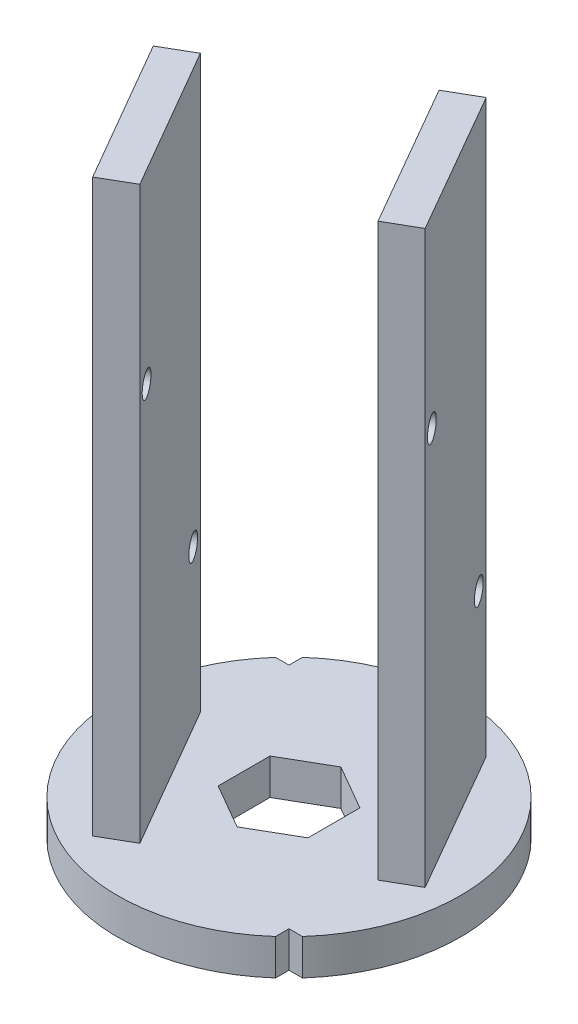
ISO-10303-21;
HEADER;
FILE_DESCRIPTION(('STEP AP214'),'2;1');
FILE_NAME('part.step','',(''),(''),'','','');
FILE_SCHEMA(('AUTOMOTIVE_DESIGN { 1 0 10303 214 1 1 1 1 }'));
ENDSEC;
DATA;
#1=APPLICATION_CONTEXT('core data for automotive mechanical design processes');
#2=APPLICATION_PROTOCOL_DEFINITION('international standard','automotive_design',2000,#1);
#3=PRODUCT_CONTEXT('',#1,'mechanical');
#4=PRODUCT('Part','Part','',(#3));
#5=PRODUCT_RELATED_PRODUCT_CATEGORY('part','',(#4));
#6=PRODUCT_DEFINITION_FORMATION('','',#4);
#7=PRODUCT_DEFINITION_CONTEXT('part definition',#1,'design');
#8=PRODUCT_DEFINITION('design','',#6,#7);
#9=PRODUCT_DEFINITION_SHAPE('','',#8);
#10=(LENGTH_UNIT() NAMED_UNIT(*) SI_UNIT(.MILLI.,.METRE.));
#11=(NAMED_UNIT(*) PLANE_ANGLE_UNIT() SI_UNIT($,.RADIAN.));
#12=(NAMED_UNIT(*) SI_UNIT($,.STERADIAN.) SOLID_ANGLE_UNIT());
#13=UNCERTAINTY_MEASURE_WITH_UNIT(LENGTH_MEASURE(1.E-05),#10,'distance_accuracy_value','');
#14=(GEOMETRIC_REPRESENTATION_CONTEXT(3) GLOBAL_UNCERTAINTY_ASSIGNED_CONTEXT((#13)) GLOBAL_UNIT_ASSIGNED_CONTEXT((#10,
#11,#12)) REPRESENTATION_CONTEXT('',''));
#15=CARTESIAN_POINT('',(0.,0.,0.));
#16=DIRECTION('',(0.,0.,1.));
#17=DIRECTION('',(1.,0.,0.));
#18=AXIS2_PLACEMENT_3D('',#15,#16,#17);
#19=CARTESIAN_POINT('',(5.00000000000001,8.,-8.6602540378444));
#20=DIRECTION('',(-0.5,0.,0.866025403784439));
#21=DIRECTION('',(0.866025403784439,0.,0.5));
#22=AXIS2_PLACEMENT_3D('',#19,#20,#21);
#23=PLANE('',#22);
#24=DIRECTION('',(-0.866025403784439,0.,-0.5));
#25=VECTOR('',#24,1.);
#26=CARTESIAN_POINT('',(5.00000000000001,0.,-8.6602540378444));
#27=LINE('',#26,#25);
#28=CARTESIAN_POINT('',(10.,0.,-5.77350269189628));
#29=VERTEX_POINT('',#28);
#30=CARTESIAN_POINT('',(0.,0.,-11.5470053837925));
#31=VERTEX_POINT('',#30);
#32=EDGE_CURVE('E302',#29,#31,#27,.T.);
#33=ORIENTED_EDGE('',*,*,#32,.F.);
#34=DIRECTION('',(0.,-1.,0.));
#35=VECTOR('',#34,1.);
#36=CARTESIAN_POINT('',(10.,8.,-5.77350269189628));
#37=LINE('',#36,#35);
#38=CARTESIAN_POINT('',(10.,8.,-5.77350269189628));
#39=VERTEX_POINT('',#38);
#40=EDGE_CURVE('E11',#39,#29,#37,.T.);
#41=ORIENTED_EDGE('',*,*,#40,.F.);
#42=DIRECTION('',(-0.866025403784439,0.,-0.5));
#43=VECTOR('',#42,1.);
#44=CARTESIAN_POINT('',(5.00000000000001,8.,-8.6602540378444));
#45=LINE('',#44,#43);
#46=CARTESIAN_POINT('',(0.,8.,-11.5470053837925));
#47=VERTEX_POINT('',#46);
#48=EDGE_CURVE('E267',#39,#47,#45,.T.);
#49=ORIENTED_EDGE('',*,*,#48,.T.);
#50=DIRECTION('',(0.,-1.,0.));
#51=VECTOR('',#50,1.);
#52=CARTESIAN_POINT('',(0.,8.,-11.5470053837925));
#53=LINE('',#52,#51);
#54=EDGE_CURVE('E319',#47,#31,#53,.T.);
#55=ORIENTED_EDGE('',*,*,#54,.T.);
#56=EDGE_LOOP('',(#33,#41,#49,#55));
#57=FACE_BOUND('',#56,.T.);
#58=ADVANCED_FACE('F41',(#57),#23,.T.);
#59=CARTESIAN_POINT('',(10.,8.,0.));
#60=DIRECTION('',(-1.,0.,0.));
#61=DIRECTION('',(0.,0.,1.));
#62=AXIS2_PLACEMENT_3D('',#59,#60,#61);
#63=PLANE('',#62);
#64=DIRECTION('',(0.,0.,-1.));
#65=VECTOR('',#64,1.);
#66=CARTESIAN_POINT('',(10.,0.,0.));
#67=LINE('',#66,#65);
#68=CARTESIAN_POINT('',(9.99999999999999,0.,5.77350269189625));
#69=VERTEX_POINT('',#68);
#70=EDGE_CURVE('E305',#69,#29,#67,.T.);
#71=ORIENTED_EDGE('',*,*,#70,.F.);
#72=DIRECTION('',(0.,-1.,0.));
#73=VECTOR('',#72,1.);
#74=CARTESIAN_POINT('',(9.99999999999999,8.,5.77350269189625));
#75=LINE('',#74,#73);
#76=CARTESIAN_POINT('',(9.99999999999999,8.,5.77350269189625));
#77=VERTEX_POINT('',#76);
#78=EDGE_CURVE('E50',#77,#69,#75,.T.);
#79=ORIENTED_EDGE('',*,*,#78,.F.);
#80=DIRECTION('',(0.,0.,-1.));
#81=VECTOR('',#80,1.);
#82=CARTESIAN_POINT('',(10.,8.,0.));
#83=LINE('',#82,#81);
#84=EDGE_CURVE('E270',#77,#39,#83,.T.);
#85=ORIENTED_EDGE('',*,*,#84,.T.);
#86=ORIENTED_EDGE('',*,*,#40,.T.);
#87=EDGE_LOOP('',(#71,#79,#85,#86));
#88=FACE_BOUND('',#87,.T.);
#89=ADVANCED_FACE('F379',(#88),#63,.T.);
#90=CARTESIAN_POINT('',(4.99999999999999,8.,8.66025403784438));
#91=DIRECTION('',(-0.5,0.,-0.866025403784439));
#92=DIRECTION('',(-0.866025403784439,0.,0.5));
#93=AXIS2_PLACEMENT_3D('',#90,#91,#92);
#94=PLANE('',#93);
#95=DIRECTION('',(0.866025403784439,0.,-0.5));
#96=VECTOR('',#95,1.);
#97=CARTESIAN_POINT('',(4.99999999999999,0.,8.66025403784438));
#98=LINE('',#97,#96);
#99=CARTESIAN_POINT('',(0.,0.,11.5470053837925));
#100=VERTEX_POINT('',#99);
#101=EDGE_CURVE('E308',#100,#69,#98,.T.);
#102=ORIENTED_EDGE('',*,*,#101,.F.);
#103=DIRECTION('',(0.,-1.,0.));
#104=VECTOR('',#103,1.);
#105=CARTESIAN_POINT('',(0.,8.,11.5470053837925));
#106=LINE('',#105,#104);
#107=CARTESIAN_POINT('',(0.,8.,11.5470053837925));
#108=VERTEX_POINT('',#107);
#109=EDGE_CURVE('E325',#108,#100,#106,.T.);
#110=ORIENTED_EDGE('',*,*,#109,.F.);
#111=DIRECTION('',(0.866025403784439,0.,-0.5));
#112=VECTOR('',#111,1.);
#113=CARTESIAN_POINT('',(4.99999999999999,8.,8.66025403784438));
#114=LINE('',#113,#112);
#115=EDGE_CURVE('E273',#108,#77,#114,.T.);
#116=ORIENTED_EDGE('',*,*,#115,.T.);
#117=ORIENTED_EDGE('',*,*,#78,.T.);
#118=EDGE_LOOP('',(#102,#110,#116,#117));
#119=FACE_BOUND('',#118,.T.);
#120=ADVANCED_FACE('F383',(#119),#94,.T.);
#121=CARTESIAN_POINT('',(-5.,8.,8.66025403784438));
#122=DIRECTION('',(0.5,0.,-0.866025403784439));
#123=DIRECTION('',(-0.866025403784439,0.,-0.5));
#124=AXIS2_PLACEMENT_3D('',#121,#122,#123);
#125=PLANE('',#124);
#126=DIRECTION('',(0.866025403784439,0.,0.5));
#127=VECTOR('',#126,1.);
#128=CARTESIAN_POINT('',(-5.,0.,8.66025403784438));
#129=LINE('',#128,#127);
#130=CARTESIAN_POINT('',(-10.,0.,5.77350269189625));
#131=VERTEX_POINT('',#130);
#132=EDGE_CURVE('E311',#131,#100,#129,.T.);
#133=ORIENTED_EDGE('',*,*,#132,.F.);
#134=DIRECTION('',(0.,-1.,0.));
#135=VECTOR('',#134,1.);
#136=CARTESIAN_POINT('',(-10.,8.,5.77350269189625));
#137=LINE('',#136,#135);
#138=CARTESIAN_POINT('',(-10.,8.,5.77350269189625));
#139=VERTEX_POINT('',#138);
#140=EDGE_CURVE('E323',#139,#131,#137,.T.);
#141=ORIENTED_EDGE('',*,*,#140,.F.);
#142=DIRECTION('',(0.866025403784439,0.,0.5));
#143=VECTOR('',#142,1.);
#144=CARTESIAN_POINT('',(-5.,8.,8.66025403784438));
#145=LINE('',#144,#143);
#146=EDGE_CURVE('E276',#139,#108,#145,.T.);
#147=ORIENTED_EDGE('',*,*,#146,.T.);
#148=ORIENTED_EDGE('',*,*,#109,.T.);
#149=EDGE_LOOP('',(#133,#141,#147,#148));
#150=FACE_BOUND('',#149,.T.);
#151=ADVANCED_FACE('F387',(#150),#125,.T.);
#152=CARTESIAN_POINT('',(-10.,8.,0.));
#153=DIRECTION('',(1.,0.,0.));
#154=DIRECTION('',(0.,0.,-1.));
#155=AXIS2_PLACEMENT_3D('',#152,#153,#154);
#156=PLANE('',#155);
#157=DIRECTION('',(0.,0.,1.));
#158=VECTOR('',#157,1.);
#159=CARTESIAN_POINT('',(-10.,0.,0.));
#160=LINE('',#159,#158);
#161=CARTESIAN_POINT('',(-10.,0.,-5.77350269189628));
#162=VERTEX_POINT('',#161);
#163=EDGE_CURVE('E314',#162,#131,#160,.T.);
#164=ORIENTED_EDGE('',*,*,#163,.F.);
#165=DIRECTION('',(0.,-1.,0.));
#166=VECTOR('',#165,1.);
#167=CARTESIAN_POINT('',(-10.,8.,-5.77350269189628));
#168=LINE('',#167,#166);
#169=CARTESIAN_POINT('',(-10.,8.,-5.77350269189628));
#170=VERTEX_POINT('',#169);
#171=EDGE_CURVE('E321',#170,#162,#168,.T.);
#172=ORIENTED_EDGE('',*,*,#171,.F.);
#173=DIRECTION('',(0.,0.,1.));
#174=VECTOR('',#173,1.);
#175=CARTESIAN_POINT('',(-10.,8.,0.));
#176=LINE('',#175,#174);
#177=EDGE_CURVE('E279',#170,#139,#176,.T.);
#178=ORIENTED_EDGE('',*,*,#177,.T.);
#179=ORIENTED_EDGE('',*,*,#140,.T.);
#180=EDGE_LOOP('',(#164,#172,#178,#179));
#181=FACE_BOUND('',#180,.T.);
#182=ADVANCED_FACE('F390',(#181),#156,.T.);
#183=CARTESIAN_POINT('',(0.,8.,-25.4));
#184=DIRECTION('',(0.,0.,1.));
#185=DIRECTION('',(1.,0.,0.));
#186=AXIS2_PLACEMENT_3D('',#183,#184,#185);
#187=PLANE('',#186);
#188=DIRECTION('',(-1.,0.,0.));
#189=VECTOR('',#188,1.);
#190=CARTESIAN_POINT('',(0.,0.,-25.4));
#191=LINE('',#190,#189);
#192=CARTESIAN_POINT('',(-25.4,0.,-25.4));
#193=VERTEX_POINT('',#192);
#194=CARTESIAN_POINT('',(-28.3980633142473,0.,-25.4));
#195=VERTEX_POINT('',#194);
#196=EDGE_CURVE('E250',#193,#195,#191,.T.);
#197=ORIENTED_EDGE('',*,*,#196,.T.);
#198=DIRECTION('',(0.,-1.,0.));
#199=VECTOR('',#198,1.);
#200=CARTESIAN_POINT('',(-28.3980633142473,8.,-25.4));
#201=LINE('',#200,#199);
#202=CARTESIAN_POINT('',(-28.3980633142473,8.,-25.4));
#203=VERTEX_POINT('',#202);
#204=EDGE_CURVE('E45',#203,#195,#201,.T.);
#205=ORIENTED_EDGE('',*,*,#204,.F.);
#206=DIRECTION('',(-1.,0.,0.));
#207=VECTOR('',#206,1.);
#208=CARTESIAN_POINT('',(0.,8.,-25.4));
#209=LINE('',#208,#207);
#210=CARTESIAN_POINT('',(-25.4,8.,-25.4));
#211=VERTEX_POINT('',#210);
#212=EDGE_CURVE('E251',#211,#203,#209,.T.);
#213=ORIENTED_EDGE('',*,*,#212,.F.);
#214=DIRECTION('',(0.,-1.,0.));
#215=VECTOR('',#214,1.);
#216=CARTESIAN_POINT('',(-25.4,8.,-25.4));
#217=LINE('',#216,#215);
#218=EDGE_CURVE('E285',#211,#193,#217,.T.);
#219=ORIENTED_EDGE('',*,*,#218,.T.);
#220=EDGE_LOOP('',(#197,#205,#213,#219));
#221=FACE_BOUND('',#220,.T.);
#222=ADVANCED_FACE('F43',(#221),#187,.F.);
#223=CARTESIAN_POINT('',(0.,8.,0.));
#224=DIRECTION('',(0.,-1.,0.));
#225=DIRECTION('',(0.,0.,-1.));
#226=AXIS2_PLACEMENT_3D('',#223,#224,#225);
#227=CYLINDRICAL_SURFACE('',#226,38.1);
#228=CARTESIAN_POINT('',(0.,0.,0.));
#229=DIRECTION('',(0.,1.,0.));
#230=DIRECTION('',(0.,0.,1.));
#231=AXIS2_PLACEMENT_3D('',#228,#229,#230);
#232=CIRCLE('',#231,38.1);
#233=CARTESIAN_POINT('',(25.4,0.,28.3980633142473));
#234=VERTEX_POINT('',#233);
#235=EDGE_CURVE('E288',#195,#234,#232,.T.);
#236=ORIENTED_EDGE('',*,*,#235,.T.);
#237=DIRECTION('',(0.,-1.,0.));
#238=VECTOR('',#237,1.);
#239=CARTESIAN_POINT('',(25.4,8.,28.3980633142473));
#240=LINE('',#239,#238);
#241=CARTESIAN_POINT('',(25.4,8.,28.3980633142473));
#242=VERTEX_POINT('',#241);
#243=EDGE_CURVE('E335',#242,#234,#240,.T.);
#244=ORIENTED_EDGE('',*,*,#243,.F.);
#245=CARTESIAN_POINT('',(0.,8.,0.));
#246=DIRECTION('',(0.,1.,0.));
#247=DIRECTION('',(0.,0.,1.));
#248=AXIS2_PLACEMENT_3D('',#245,#246,#247);
#249=CIRCLE('',#248,38.1);
#250=EDGE_CURVE('E254',#203,#242,#249,.T.);
#251=ORIENTED_EDGE('',*,*,#250,.F.);
#252=ORIENTED_EDGE('',*,*,#204,.T.);
#253=EDGE_LOOP('',(#236,#244,#251,#252));
#254=FACE_BOUND('',#253,.T.);
#255=ADVANCED_FACE('F342',(#254),#227,.T.);
#256=CARTESIAN_POINT('',(25.4,8.,0.));
#257=DIRECTION('',(1.,0.,0.));
#258=DIRECTION('',(0.,0.,-1.));
#259=AXIS2_PLACEMENT_3D('',#256,#257,#258);
#260=PLANE('',#259);
#261=DIRECTION('',(0.,0.,1.));
#262=VECTOR('',#261,1.);
#263=CARTESIAN_POINT('',(25.4,0.,0.));
#264=LINE('',#263,#262);
#265=CARTESIAN_POINT('',(25.4,0.,25.4));
#266=VERTEX_POINT('',#265);
#267=EDGE_CURVE('E291',#266,#234,#264,.T.);
#268=ORIENTED_EDGE('',*,*,#267,.F.);
#269=DIRECTION('',(0.,-1.,0.));
#270=VECTOR('',#269,1.);
#271=CARTESIAN_POINT('',(25.4,8.,25.4));
#272=LINE('',#271,#270);
#273=CARTESIAN_POINT('',(25.4,8.,25.4));
#274=VERTEX_POINT('',#273);
#275=EDGE_CURVE('E334',#274,#266,#272,.T.);
#276=ORIENTED_EDGE('',*,*,#275,.F.);
#277=DIRECTION('',(0.,0.,1.));
#278=VECTOR('',#277,1.);
#279=CARTESIAN_POINT('',(25.4,8.,0.));
#280=LINE('',#279,#278);
#281=EDGE_CURVE('E257',#274,#242,#280,.T.);
#282=ORIENTED_EDGE('',*,*,#281,.T.);
#283=ORIENTED_EDGE('',*,*,#243,.T.);
#284=EDGE_LOOP('',(#268,#276,#282,#283));
#285=FACE_BOUND('',#284,.T.);
#286=ADVANCED_FACE('F361',(#285),#260,.T.);
#287=CARTESIAN_POINT('',(0.,8.,25.4));
#288=DIRECTION('',(0.,0.,-1.));
#289=DIRECTION('',(-1.,0.,0.));
#290=AXIS2_PLACEMENT_3D('',#287,#288,#289);
#291=PLANE('',#290);
#292=DIRECTION('',(1.,0.,0.));
#293=VECTOR('',#292,1.);
#294=CARTESIAN_POINT('',(0.,0.,25.4));
#295=LINE('',#294,#293);
#296=CARTESIAN_POINT('',(28.3980633142473,0.,25.4));
#297=VERTEX_POINT('',#296);
#298=EDGE_CURVE('E294',#266,#297,#295,.T.);
#299=ORIENTED_EDGE('',*,*,#298,.T.);
#300=DIRECTION('',(0.,-1.,0.));
#301=VECTOR('',#300,1.);
#302=CARTESIAN_POINT('',(28.3980633142473,8.,25.4));
#303=LINE('',#302,#301);
#304=CARTESIAN_POINT('',(28.3980633142473,8.,25.4));
#305=VERTEX_POINT('',#304);
#306=EDGE_CURVE('E331',#305,#297,#303,.T.);
#307=ORIENTED_EDGE('',*,*,#306,.F.);
#308=DIRECTION('',(1.,0.,0.));
#309=VECTOR('',#308,1.);
#310=CARTESIAN_POINT('',(0.,8.,25.4));
#311=LINE('',#310,#309);
#312=EDGE_CURVE('E260',#274,#305,#311,.T.);
#313=ORIENTED_EDGE('',*,*,#312,.F.);
#314=ORIENTED_EDGE('',*,*,#275,.T.);
#315=EDGE_LOOP('',(#299,#307,#313,#314));
#316=FACE_BOUND('',#315,.T.);
#317=ADVANCED_FACE('F364',(#316),#291,.F.);
#318=CARTESIAN_POINT('',(0.,8.,0.));
#319=DIRECTION('',(0.,-1.,0.));
#320=DIRECTION('',(0.,0.,-1.));
#321=AXIS2_PLACEMENT_3D('',#318,#319,#320);
#322=CYLINDRICAL_SURFACE('',#321,38.1);
#323=CARTESIAN_POINT('',(0.,0.,0.));
#324=DIRECTION('',(0.,1.,0.));
#325=DIRECTION('',(0.,0.,1.));
#326=AXIS2_PLACEMENT_3D('',#323,#324,#325);
#327=CIRCLE('',#326,38.1);
#328=CARTESIAN_POINT('',(-25.4,0.,-28.3980633142473));
#329=VERTEX_POINT('',#328);
#330=EDGE_CURVE('E296',#297,#329,#327,.T.);
#331=ORIENTED_EDGE('',*,*,#330,.T.);
#332=DIRECTION('',(0.,-1.,0.));
#333=VECTOR('',#332,1.);
#334=CARTESIAN_POINT('',(-25.4,8.,-28.3980633142473));
#335=LINE('',#334,#333);
#336=CARTESIAN_POINT('',(-25.4,8.,-28.3980633142473));
#337=VERTEX_POINT('',#336);
#338=EDGE_CURVE('E329',#337,#329,#335,.T.);
#339=ORIENTED_EDGE('',*,*,#338,.F.);
#340=CARTESIAN_POINT('',(0.,8.,0.));
#341=DIRECTION('',(0.,1.,0.));
#342=DIRECTION('',(0.,0.,1.));
#343=AXIS2_PLACEMENT_3D('',#340,#341,#342);
#344=CIRCLE('',#343,38.1);
#345=EDGE_CURVE('E262',#305,#337,#344,.T.);
#346=ORIENTED_EDGE('',*,*,#345,.F.);
#347=ORIENTED_EDGE('',*,*,#306,.T.);
#348=EDGE_LOOP('',(#331,#339,#346,#347));
#349=FACE_BOUND('',#348,.T.);
#350=ADVANCED_FACE('F357',(#349),#322,.T.);
#351=CARTESIAN_POINT('',(-25.4,8.,0.));
#352=DIRECTION('',(-1.,0.,0.));
#353=DIRECTION('',(0.,0.,1.));
#354=AXIS2_PLACEMENT_3D('',#351,#352,#353);
#355=PLANE('',#354);
#356=DIRECTION('',(0.,0.,-1.));
#357=VECTOR('',#356,1.);
#358=CARTESIAN_POINT('',(-25.4,0.,0.));
#359=LINE('',#358,#357);
#360=EDGE_CURVE('E299',#193,#329,#359,.T.);
#361=ORIENTED_EDGE('',*,*,#360,.F.);
#362=ORIENTED_EDGE('',*,*,#218,.F.);
#363=DIRECTION('',(0.,0.,-1.));
#364=VECTOR('',#363,1.);
#365=CARTESIAN_POINT('',(-25.4,8.,0.));
#366=LINE('',#365,#364);
#367=EDGE_CURVE('E264',#211,#337,#366,.T.);
#368=ORIENTED_EDGE('',*,*,#367,.T.);
#369=ORIENTED_EDGE('',*,*,#338,.T.);
#370=EDGE_LOOP('',(#361,#362,#368,#369));
#371=FACE_BOUND('',#370,.T.);
#372=ADVANCED_FACE('F352',(#371),#355,.T.);
#373=CARTESIAN_POINT('',(-5.,8.,-8.66025403784441));
#374=DIRECTION('',(0.499999999999999,0.,0.866025403784439));
#375=DIRECTION('',(0.866025403784439,0.,-0.499999999999999));
#376=AXIS2_PLACEMENT_3D('',#373,#374,#375);
#377=PLANE('',#376);
#378=DIRECTION('',(-0.866025403784439,0.,0.499999999999999));
#379=VECTOR('',#378,1.);
#380=CARTESIAN_POINT('',(-5.,0.,-8.66025403784441));
#381=LINE('',#380,#379);
#382=EDGE_CURVE('E255',#31,#162,#381,.T.);
#383=ORIENTED_EDGE('',*,*,#382,.F.);
#384=ORIENTED_EDGE('',*,*,#54,.F.);
#385=DIRECTION('',(-0.866025403784439,0.,0.499999999999999));
#386=VECTOR('',#385,1.);
#387=CARTESIAN_POINT('',(-5.,8.,-8.66025403784441));
#388=LINE('',#387,#386);
#389=EDGE_CURVE('E282',#47,#170,#388,.T.);
#390=ORIENTED_EDGE('',*,*,#389,.T.);
#391=ORIENTED_EDGE('',*,*,#171,.T.);
#392=EDGE_LOOP('',(#383,#384,#390,#391));
#393=FACE_BOUND('',#392,.T.);
#394=ADVANCED_FACE('F369',(#393),#377,.T.);
#395=CARTESIAN_POINT('',(0.,8.,0.));
#396=DIRECTION('',(0.,1.,0.));
#397=DIRECTION('',(0.,0.,1.));
#398=AXIS2_PLACEMENT_3D('',#395,#396,#397);
#399=PLANE('',#398);
#400=DIRECTION('',(0.866596907699709,0.,-0.499008817121804));
#401=VECTOR('',#400,1.);
#402=CARTESIAN_POINT('',(14.151892841374,7.99999999999999,-29.7321401224026));
#403=LINE('',#402,#401);
#404=CARTESIAN_POINT('',(7.49466333586674,8.,-25.8987359279779));
#405=VERTEX_POINT('',#404);
#406=CARTESIAN_POINT('',(14.151892841374,7.99999999999999,-29.7321401224026));
#407=VERTEX_POINT('',#406);
#408=EDGE_CURVE('E184',#405,#407,#403,.T.);
#409=ORIENTED_EDGE('',*,*,#408,.T.);
#410=DIRECTION('',(0.499008817121804,0.,0.866596907699709));
#411=VECTOR('',#410,1.);
#412=CARTESIAN_POINT('',(14.151892841374,7.99999999999999,-29.7321401224026));
#413=LINE('',#412,#411);
#414=CARTESIAN_POINT('',(32.5956910765059,8.,2.29803242843875));
#415=VERTEX_POINT('',#414);
#416=EDGE_CURVE('E198',#407,#415,#413,.T.);
#417=ORIENTED_EDGE('',*,*,#416,.T.);
#418=DIRECTION('',(-0.866596907699709,0.,0.499008817121804));
#419=VECTOR('',#418,1.);
#420=CARTESIAN_POINT('',(32.5956910765059,7.99999999999999,2.29803242843875));
#421=LINE('',#420,#419);
#422=CARTESIAN_POINT('',(25.9384615709986,8.,6.13143662286348));
#423=VERTEX_POINT('',#422);
#424=EDGE_CURVE('E63',#415,#423,#421,.T.);
#425=ORIENTED_EDGE('',*,*,#424,.T.);
#426=DIRECTION('',(-0.499008817121804,0.,-0.866596907699709));
#427=VECTOR('',#426,1.);
#428=CARTESIAN_POINT('',(7.49466333586675,7.99999999999999,-25.8987359279779));
#429=LINE('',#428,#427);
#430=EDGE_CURVE('E58',#423,#405,#429,.T.);
#431=ORIENTED_EDGE('',*,*,#430,.T.);
#432=EDGE_LOOP('',(#409,#417,#425,#431));
#433=FACE_BOUND('',#432,.T.);
#434=DIRECTION('',(-0.86545276618976,0.,0.500990528348084));
#435=VECTOR('',#434,1.);
#436=CARTESIAN_POINT('',(-32.8247350755662,8.,-2.61017134893628));
#437=LINE('',#436,#435);
#438=CARTESIAN_POINT('',(-26.176294907467,8.,-6.45879912231654));
#439=VERTEX_POINT('',#438);
#440=CARTESIAN_POINT('',(-32.8247350755662,8.,-2.61017134893628));
#441=VERTEX_POINT('',#440);
#442=EDGE_CURVE('E187',#439,#441,#437,.T.);
#443=ORIENTED_EDGE('',*,*,#442,.F.);
#444=DIRECTION('',(-0.500990528348084,0.,-0.86545276618976));
#445=VECTOR('',#444,1.);
#446=CARTESIAN_POINT('',(-26.176294907467,8.,-6.45879912231654));
#447=LINE('',#446,#445);
#448=CARTESIAN_POINT('',(-7.65925090840529,8.,25.5290849670029));
#449=VERTEX_POINT('',#448);
#450=EDGE_CURVE('E222',#449,#439,#447,.T.);
#451=ORIENTED_EDGE('',*,*,#450,.F.);
#452=DIRECTION('',(0.86545276618976,0.,-0.500990528348084));
#453=VECTOR('',#452,1.);
#454=CARTESIAN_POINT('',(-14.3076910765046,8.,29.3777127403832));
#455=LINE('',#454,#453);
#456=CARTESIAN_POINT('',(-14.3076910765046,8.,29.3777127403832));
#457=VERTEX_POINT('',#456);
#458=EDGE_CURVE('E234',#457,#449,#455,.T.);
#459=ORIENTED_EDGE('',*,*,#458,.F.);
#460=DIRECTION('',(0.500990528348084,0.,0.86545276618976));
#461=VECTOR('',#460,1.);
#462=CARTESIAN_POINT('',(-32.8247350755662,8.,-2.61017134893628));
#463=LINE('',#462,#461);
#464=EDGE_CURVE('E231',#441,#457,#463,.T.);
#465=ORIENTED_EDGE('',*,*,#464,.F.);
#466=EDGE_LOOP('',(#443,#451,#459,#465));
#467=FACE_BOUND('',#466,.T.);
#468=ORIENTED_EDGE('',*,*,#212,.T.);
#469=ORIENTED_EDGE('',*,*,#250,.T.);
#470=ORIENTED_EDGE('',*,*,#281,.F.);
#471=ORIENTED_EDGE('',*,*,#312,.T.);
#472=ORIENTED_EDGE('',*,*,#345,.T.);
#473=ORIENTED_EDGE('',*,*,#367,.F.);
#474=EDGE_LOOP('',(#468,#469,#470,#471,#472,#473));
#475=FACE_BOUND('',#474,.T.);
#476=ORIENTED_EDGE('',*,*,#48,.F.);
#477=ORIENTED_EDGE('',*,*,#84,.F.);
#478=ORIENTED_EDGE('',*,*,#115,.F.);
#479=ORIENTED_EDGE('',*,*,#146,.F.);
#480=ORIENTED_EDGE('',*,*,#177,.F.);
#481=ORIENTED_EDGE('',*,*,#389,.F.);
#482=EDGE_LOOP('',(#476,#477,#478,#479,#480,#481));
#483=FACE_BOUND('',#482,.T.);
#484=ADVANCED_FACE('F366',(#433,#467,#475,#483),#399,.T.);
#485=CARTESIAN_POINT('',(0.,0.,0.));
#486=DIRECTION('',(0.,1.,0.));
#487=DIRECTION('',(0.,0.,1.));
#488=AXIS2_PLACEMENT_3D('',#485,#486,#487);
#489=PLANE('',#488);
#490=ORIENTED_EDGE('',*,*,#196,.F.);
#491=ORIENTED_EDGE('',*,*,#360,.T.);
#492=ORIENTED_EDGE('',*,*,#330,.F.);
#493=ORIENTED_EDGE('',*,*,#298,.F.);
#494=ORIENTED_EDGE('',*,*,#267,.T.);
#495=ORIENTED_EDGE('',*,*,#235,.F.);
#496=EDGE_LOOP('',(#490,#491,#492,#493,#494,#495));
#497=FACE_BOUND('',#496,.T.);
#498=ORIENTED_EDGE('',*,*,#32,.T.);
#499=ORIENTED_EDGE('',*,*,#382,.T.);
#500=ORIENTED_EDGE('',*,*,#163,.T.);
#501=ORIENTED_EDGE('',*,*,#132,.T.);
#502=ORIENTED_EDGE('',*,*,#101,.T.);
#503=ORIENTED_EDGE('',*,*,#70,.T.);
#504=EDGE_LOOP('',(#498,#499,#500,#501,#502,#503));
#505=FACE_BOUND('',#504,.T.);
#506=ADVANCED_FACE('F348',(#497,#505),#489,.F.);
#507=CARTESIAN_POINT('',(-32.8247350755662,135.,-2.61017134893628));
#508=DIRECTION('',(0.500990528348084,0.,0.86545276618976));
#509=DIRECTION('',(0.86545276618976,0.,-0.500990528348084));
#510=AXIS2_PLACEMENT_3D('',#507,#508,#509);
#511=PLANE('',#510);
#512=ORIENTED_EDGE('',*,*,#442,.T.);
#513=DIRECTION('',(0.,-1.,0.));
#514=VECTOR('',#513,1.);
#515=CARTESIAN_POINT('',(-32.8247350755662,135.,-2.61017134893628));
#516=LINE('',#515,#514);
#517=CARTESIAN_POINT('',(-32.8247350755662,135.,-2.61017134893628));
#518=VERTEX_POINT('',#517);
#519=EDGE_CURVE('E247',#518,#441,#516,.T.);
#520=ORIENTED_EDGE('',*,*,#519,.F.);
#521=DIRECTION('',(-0.86545276618976,0.,0.500990528348084));
#522=VECTOR('',#521,1.);
#523=CARTESIAN_POINT('',(-32.8247350755662,135.,-2.61017134893628));
#524=LINE('',#523,#522);
#525=CARTESIAN_POINT('',(-26.176294907467,135.,-6.45879912231654));
#526=VERTEX_POINT('',#525);
#527=EDGE_CURVE('E218',#526,#518,#524,.T.);
#528=ORIENTED_EDGE('',*,*,#527,.F.);
#529=DIRECTION('',(0.,-1.,0.));
#530=VECTOR('',#529,1.);
#531=CARTESIAN_POINT('',(-26.176294907467,135.,-6.45879912231654));
#532=LINE('',#531,#530);
#533=EDGE_CURVE('E228',#526,#439,#532,.T.);
#534=ORIENTED_EDGE('',*,*,#533,.T.);
#535=EDGE_LOOP('',(#512,#520,#528,#534));
#536=FACE_BOUND('',#535,.T.);
#537=ADVANCED_FACE('F394',(#536),#511,.F.);
#538=CARTESIAN_POINT('',(-32.8247350755662,135.,-2.61017134893628));
#539=DIRECTION('',(0.86545276618976,0.,-0.500990528348084));
#540=DIRECTION('',(-0.500990528348084,0.,-0.86545276618976));
#541=AXIS2_PLACEMENT_3D('',#538,#539,#540);
#542=PLANE('',#541);
#543=CARTESIAN_POINT('',(-16.3701623708894,93.725,25.8148280431458));
#544=DIRECTION('',(0.86545276618976,0.,-0.500990528348084));
#545=DIRECTION('',(0.500990528348084,-1.02586609897164E-13,0.86545276618976));
#546=AXIS2_PLACEMENT_3D('',#543,#544,#545);
#547=ELLIPSE('',#546,2.66700698254323,2.667);
#548=CARTESIAN_POINT('',(-15.034017133597,93.7249999999997,28.1229966136352));
#549=VERTEX_POINT('',#548);
#550=EDGE_CURVE('E209',#549,#549,#547,.T.);
#551=ORIENTED_EDGE('',*,*,#550,.T.);
#552=EDGE_LOOP('',(#551));
#553=FACE_BOUND('',#552,.T.);
#554=CARTESIAN_POINT('',(-30.6223689068368,42.925,1.19437940609392));
#555=DIRECTION('',(0.86545276618976,0.,-0.500990528348084));
#556=DIRECTION('',(0.500990528348084,-1.02586609897164E-13,0.86545276618976));
#557=AXIS2_PLACEMENT_3D('',#554,#555,#556);
#558=ELLIPSE('',#557,2.66700698254322,2.667);
#559=CARTESIAN_POINT('',(-29.2862236695444,42.9249999999997,3.50254797658336));
#560=VERTEX_POINT('',#559);
#561=EDGE_CURVE('E639',#560,#560,#558,.T.);
#562=ORIENTED_EDGE('',*,*,#561,.T.);
#563=EDGE_LOOP('',(#562));
#564=FACE_BOUND('',#563,.T.);
#565=ORIENTED_EDGE('',*,*,#464,.T.);
#566=DIRECTION('',(0.,-1.,0.));
#567=VECTOR('',#566,1.);
#568=CARTESIAN_POINT('',(-14.3076910765046,135.,29.3777127403832));
#569=LINE('',#568,#567);
#570=CARTESIAN_POINT('',(-14.3076910765046,135.,29.3777127403832));
#571=VERTEX_POINT('',#570);
#572=EDGE_CURVE('E244',#571,#457,#569,.T.);
#573=ORIENTED_EDGE('',*,*,#572,.F.);
#574=DIRECTION('',(0.500990528348084,0.,0.86545276618976));
#575=VECTOR('',#574,1.);
#576=CARTESIAN_POINT('',(-32.8247350755662,135.,-2.61017134893628));
#577=LINE('',#576,#575);
#578=EDGE_CURVE('E221',#518,#571,#577,.T.);
#579=ORIENTED_EDGE('',*,*,#578,.F.);
#580=ORIENTED_EDGE('',*,*,#519,.T.);
#581=EDGE_LOOP('',(#565,#573,#579,#580));
#582=FACE_BOUND('',#581,.T.);
#583=ADVANCED_FACE('F399',(#553,#564,#582),#542,.F.);
#584=CARTESIAN_POINT('',(-14.3076910765046,135.,29.3777127403832));
#585=DIRECTION('',(-0.500990528348084,0.,-0.86545276618976));
#586=DIRECTION('',(-0.86545276618976,0.,0.500990528348084));
#587=AXIS2_PLACEMENT_3D('',#584,#585,#586);
#588=PLANE('',#587);
#589=ORIENTED_EDGE('',*,*,#458,.T.);
#590=DIRECTION('',(0.,-1.,0.));
#591=VECTOR('',#590,1.);
#592=CARTESIAN_POINT('',(-7.65925090840529,135.,25.5290849670029));
#593=LINE('',#592,#591);
#594=CARTESIAN_POINT('',(-7.65925090840529,135.,25.5290849670029));
#595=VERTEX_POINT('',#594);
#596=EDGE_CURVE('E241',#595,#449,#593,.T.);
#597=ORIENTED_EDGE('',*,*,#596,.F.);
#598=DIRECTION('',(0.86545276618976,0.,-0.500990528348084));
#599=VECTOR('',#598,1.);
#600=CARTESIAN_POINT('',(-14.3076910765046,135.,29.3777127403832));
#601=LINE('',#600,#599);
#602=EDGE_CURVE('E224',#571,#595,#601,.T.);
#603=ORIENTED_EDGE('',*,*,#602,.F.);
#604=ORIENTED_EDGE('',*,*,#572,.T.);
#605=EDGE_LOOP('',(#589,#597,#603,#604));
#606=FACE_BOUND('',#605,.T.);
#607=ADVANCED_FACE('F501',(#606),#588,.F.);
#608=CARTESIAN_POINT('',(-26.176294907467,135.,-6.45879912231654));
#609=DIRECTION('',(-0.86545276618976,0.,0.500990528348084));
#610=DIRECTION('',(0.500990528348084,0.,0.86545276618976));
#611=AXIS2_PLACEMENT_3D('',#608,#609,#610);
#612=PLANE('',#611);
#613=CARTESIAN_POINT('',(-9.71291543591345,93.725,21.9814138123841));
#614=DIRECTION('',(-0.86545276618976,0.,0.500990528348084));
#615=DIRECTION('',(0.500990528348084,-1.02586609897159E-13,0.86545276618976));
#616=AXIS2_PLACEMENT_3D('',#613,#614,#615);
#617=ELLIPSE('',#616,2.66700698254323,2.667);
#618=CARTESIAN_POINT('',(-8.37677019862109,93.7249999999997,24.2895823828736));
#619=VERTEX_POINT('',#618);
#620=EDGE_CURVE('E631',#619,#619,#617,.T.);
#621=ORIENTED_EDGE('',*,*,#620,.T.);
#622=EDGE_LOOP('',(#621));
#623=FACE_BOUND('',#622,.T.);
#624=CARTESIAN_POINT('',(-23.9651219718608,42.925,-2.63903482466771));
#625=DIRECTION('',(-0.86545276618976,0.,0.500990528348084));
#626=DIRECTION('',(0.500990528348084,-1.02586609897159E-13,0.86545276618976));
#627=AXIS2_PLACEMENT_3D('',#624,#625,#626);
#628=ELLIPSE('',#627,2.66700698254322,2.667);
#629=CARTESIAN_POINT('',(-22.6289767345685,42.9249999999997,-0.330866254178268));
#630=VERTEX_POINT('',#629);
#631=EDGE_CURVE('E642',#630,#630,#628,.T.);
#632=ORIENTED_EDGE('',*,*,#631,.T.);
#633=EDGE_LOOP('',(#632));
#634=FACE_BOUND('',#633,.T.);
#635=ORIENTED_EDGE('',*,*,#450,.T.);
#636=ORIENTED_EDGE('',*,*,#533,.F.);
#637=DIRECTION('',(-0.500990528348084,0.,-0.86545276618976));
#638=VECTOR('',#637,1.);
#639=CARTESIAN_POINT('',(-26.176294907467,135.,-6.45879912231654));
#640=LINE('',#639,#638);
#641=EDGE_CURVE('E226',#595,#526,#640,.T.);
#642=ORIENTED_EDGE('',*,*,#641,.F.);
#643=ORIENTED_EDGE('',*,*,#596,.T.);
#644=EDGE_LOOP('',(#635,#636,#642,#643));
#645=FACE_BOUND('',#644,.T.);
#646=ADVANCED_FACE('F506',(#623,#634,#645),#612,.F.);
#647=CARTESIAN_POINT('',(0.,135.,0.));
#648=DIRECTION('',(0.,-1.,0.));
#649=DIRECTION('',(0.,0.,-1.));
#650=AXIS2_PLACEMENT_3D('',#647,#648,#649);
#651=PLANE('',#650);
#652=ORIENTED_EDGE('',*,*,#527,.T.);
#653=ORIENTED_EDGE('',*,*,#578,.T.);
#654=ORIENTED_EDGE('',*,*,#602,.T.);
#655=ORIENTED_EDGE('',*,*,#641,.T.);
#656=EDGE_LOOP('',(#652,#653,#654,#655));
#657=FACE_BOUND('',#656,.T.);
#658=ADVANCED_FACE('F514',(#657),#651,.F.);
#659=CARTESIAN_POINT('',(14.1518928413741,135.,-29.7321401224026));
#660=DIRECTION('',(-0.499008817121804,0.,-0.866596907699709));
#661=DIRECTION('',(-0.866596907699709,0.,0.499008817121804));
#662=AXIS2_PLACEMENT_3D('',#659,#660,#661);
#663=PLANE('',#662);
#664=ORIENTED_EDGE('',*,*,#408,.F.);
#665=DIRECTION('',(0.,-1.,0.));
#666=VECTOR('',#665,1.);
#667=CARTESIAN_POINT('',(7.49466333586678,135.,-25.8987359279779));
#668=LINE('',#667,#666);
#669=CARTESIAN_POINT('',(7.49466333586678,135.,-25.8987359279779));
#670=VERTEX_POINT('',#669);
#671=EDGE_CURVE('E178',#670,#405,#668,.T.);
#672=ORIENTED_EDGE('',*,*,#671,.F.);
#673=DIRECTION('',(0.866596907699709,0.,-0.499008817121804));
#674=VECTOR('',#673,1.);
#675=CARTESIAN_POINT('',(14.1518928413741,135.,-29.7321401224026));
#676=LINE('',#675,#674);
#677=CARTESIAN_POINT('',(14.1518928413741,135.,-29.7321401224026));
#678=VERTEX_POINT('',#677);
#679=EDGE_CURVE('E182',#670,#678,#676,.T.);
#680=ORIENTED_EDGE('',*,*,#679,.T.);
#681=DIRECTION('',(0.,-1.,0.));
#682=VECTOR('',#681,1.);
#683=CARTESIAN_POINT('',(14.1518928413741,135.,-29.7321401224026));
#684=LINE('',#683,#682);
#685=EDGE_CURVE('E207',#678,#407,#684,.T.);
#686=ORIENTED_EDGE('',*,*,#685,.T.);
#687=EDGE_LOOP('',(#664,#672,#680,#686));
#688=FACE_BOUND('',#687,.T.);
#689=ADVANCED_FACE('F180',(#688),#663,.T.);
#690=CARTESIAN_POINT('',(7.49466333586678,135.,-25.8987359279779));
#691=DIRECTION('',(-0.866596907699709,0.,0.499008817121804));
#692=DIRECTION('',(0.499008817121804,0.,0.866596907699709));
#693=AXIS2_PLACEMENT_3D('',#690,#691,#692);
#694=PLANE('',#693);
#695=CARTESIAN_POINT('',(23.9150755047756,93.725,2.61755059939565));
#696=DIRECTION('',(-0.866596907699709,0.,0.499008817121804));
#697=DIRECTION('',(0.499008817121804,0.,0.866596907699709));
#698=AXIS2_PLACEMENT_3D('',#695,#696,#697);
#699=CIRCLE('',#698,2.667);
#700=CARTESIAN_POINT('',(25.2459320200395,93.725,4.92876455223077));
#701=VERTEX_POINT('',#700);
#702=EDGE_CURVE('E634',#701,#701,#699,.T.);
#703=ORIENTED_EDGE('',*,*,#702,.F.);
#704=EDGE_LOOP('',(#703));
#705=FACE_BOUND('',#704,.T.);
#706=CARTESIAN_POINT('',(9.71928196687494,42.925,-22.0353820947483));
#707=DIRECTION('',(-0.866596907699709,0.,0.499008817121804));
#708=DIRECTION('',(0.499008817121804,0.,0.866596907699709));
#709=AXIS2_PLACEMENT_3D('',#706,#707,#708);
#710=CIRCLE('',#709,2.667);
#711=CARTESIAN_POINT('',(11.0501384821388,42.925,-19.7241681419132));
#712=VERTEX_POINT('',#711);
#713=EDGE_CURVE('E645',#712,#712,#710,.T.);
#714=ORIENTED_EDGE('',*,*,#713,.F.);
#715=EDGE_LOOP('',(#714));
#716=FACE_BOUND('',#715,.T.);
#717=ORIENTED_EDGE('',*,*,#430,.F.);
#718=DIRECTION('',(0.,-1.,0.));
#719=VECTOR('',#718,1.);
#720=CARTESIAN_POINT('',(25.9384615709986,135.,6.13143662286347));
#721=LINE('',#720,#719);
#722=CARTESIAN_POINT('',(25.9384615709986,135.,6.13143662286347));
#723=VERTEX_POINT('',#722);
#724=EDGE_CURVE('E188',#723,#423,#721,.T.);
#725=ORIENTED_EDGE('',*,*,#724,.F.);
#726=DIRECTION('',(-0.499008817121804,0.,-0.866596907699709));
#727=VECTOR('',#726,1.);
#728=CARTESIAN_POINT('',(7.49466333586678,135.,-25.8987359279779));
#729=LINE('',#728,#727);
#730=EDGE_CURVE('E194',#723,#670,#729,.T.);
#731=ORIENTED_EDGE('',*,*,#730,.T.);
#732=ORIENTED_EDGE('',*,*,#671,.T.);
#733=EDGE_LOOP('',(#717,#725,#731,#732));
#734=FACE_BOUND('',#733,.T.);
#735=ADVANCED_FACE('F200',(#705,#716,#734),#694,.T.);
#736=CARTESIAN_POINT('',(32.5956910765059,135.,2.29803242843874));
#737=DIRECTION('',(0.499008817121804,0.,0.866596907699709));
#738=DIRECTION('',(0.866596907699709,0.,-0.499008817121804));
#739=AXIS2_PLACEMENT_3D('',#736,#737,#738);
#740=PLANE('',#739);
#741=ORIENTED_EDGE('',*,*,#424,.F.);
#742=DIRECTION('',(0.,-1.,0.));
#743=VECTOR('',#742,1.);
#744=CARTESIAN_POINT('',(32.5956910765059,135.,2.29803242843874));
#745=LINE('',#744,#743);
#746=CARTESIAN_POINT('',(32.5956910765059,135.,2.29803242843874));
#747=VERTEX_POINT('',#746);
#748=EDGE_CURVE('E214',#747,#415,#745,.T.);
#749=ORIENTED_EDGE('',*,*,#748,.F.);
#750=DIRECTION('',(-0.866596907699709,0.,0.499008817121804));
#751=VECTOR('',#750,1.);
#752=CARTESIAN_POINT('',(32.5956910765059,135.,2.29803242843874));
#753=LINE('',#752,#751);
#754=EDGE_CURVE('E201',#747,#723,#753,.T.);
#755=ORIENTED_EDGE('',*,*,#754,.T.);
#756=ORIENTED_EDGE('',*,*,#724,.T.);
#757=EDGE_LOOP('',(#741,#749,#755,#756));
#758=FACE_BOUND('',#757,.T.);
#759=ADVANCED_FACE('F542',(#758),#740,.T.);
#760=CARTESIAN_POINT('',(14.1518928413741,135.,-29.7321401224026));
#761=DIRECTION('',(0.866596907699709,0.,-0.499008817121804));
#762=DIRECTION('',(-0.499008817121804,0.,-0.866596907699709));
#763=AXIS2_PLACEMENT_3D('',#760,#761,#762);
#764=PLANE('',#763);
#765=CARTESIAN_POINT('',(30.5723050102829,93.725,-1.2158535950291));
#766=DIRECTION('',(0.866596907699709,0.,-0.499008817121804));
#767=DIRECTION('',(-0.499008817121804,0.,-0.866596907699709));
#768=AXIS2_PLACEMENT_3D('',#765,#766,#767);
#769=CIRCLE('',#768,2.667);
#770=CARTESIAN_POINT('',(29.2414484950191,93.725,-3.52706754786422));
#771=VERTEX_POINT('',#770);
#772=EDGE_CURVE('E648',#771,#771,#769,.T.);
#773=ORIENTED_EDGE('',*,*,#772,.F.);
#774=EDGE_LOOP('',(#773));
#775=FACE_BOUND('',#774,.T.);
#776=CARTESIAN_POINT('',(16.3765114723823,42.925,-25.8687862891731));
#777=DIRECTION('',(0.866596907699709,0.,-0.499008817121804));
#778=DIRECTION('',(-0.499008817121804,0.,-0.866596907699709));
#779=AXIS2_PLACEMENT_3D('',#776,#777,#778);
#780=CIRCLE('',#779,2.667);
#781=CARTESIAN_POINT('',(15.0456549571184,42.925,-28.1800002420082));
#782=VERTEX_POINT('',#781);
#783=EDGE_CURVE('E649',#782,#782,#780,.T.);
#784=ORIENTED_EDGE('',*,*,#783,.F.);
#785=EDGE_LOOP('',(#784));
#786=FACE_BOUND('',#785,.T.);
#787=ORIENTED_EDGE('',*,*,#416,.F.);
#788=ORIENTED_EDGE('',*,*,#685,.F.);
#789=DIRECTION('',(0.499008817121804,0.,0.866596907699709));
#790=VECTOR('',#789,1.);
#791=CARTESIAN_POINT('',(14.1518928413741,135.,-29.7321401224026));
#792=LINE('',#791,#790);
#793=EDGE_CURVE('E197',#678,#747,#792,.T.);
#794=ORIENTED_EDGE('',*,*,#793,.T.);
#795=ORIENTED_EDGE('',*,*,#748,.T.);
#796=EDGE_LOOP('',(#787,#788,#794,#795));
#797=FACE_BOUND('',#796,.T.);
#798=ADVANCED_FACE('F547',(#775,#786,#797),#764,.T.);
#799=CARTESIAN_POINT('',(0.,135.,0.));
#800=DIRECTION('',(0.,-1.,0.));
#801=DIRECTION('',(-0.866025403784438,0.,-0.500000000000001));
#802=AXIS2_PLACEMENT_3D('',#799,#800,#801);
#803=PLANE('',#802);
#804=ORIENTED_EDGE('',*,*,#679,.F.);
#805=ORIENTED_EDGE('',*,*,#730,.F.);
#806=ORIENTED_EDGE('',*,*,#754,.F.);
#807=ORIENTED_EDGE('',*,*,#793,.F.);
#808=EDGE_LOOP('',(#804,#805,#806,#807));
#809=FACE_BOUND('',#808,.T.);
#810=ADVANCED_FACE('F192',(#809),#803,.F.);
#811=CARTESIAN_POINT('',(-93.6812958054808,42.925,37.505333485296));
#812=DIRECTION('',(0.866596907699709,0.,-0.499008817121804));
#813=DIRECTION('',(-0.499008817121804,0.,-0.866596907699709));
#814=AXIS2_PLACEMENT_3D('',#811,#812,#813);
#815=CYLINDRICAL_SURFACE('',#814,2.667);
#816=ORIENTED_EDGE('',*,*,#713,.T.);
#817=EDGE_LOOP('',(#816));
#818=FACE_BOUND('',#817,.T.);
#819=ORIENTED_EDGE('',*,*,#783,.T.);
#820=EDGE_LOOP('',(#819));
#821=FACE_BOUND('',#820,.T.);
#822=ADVANCED_FACE('F559',(#818,#821),#815,.F.);
#823=CARTESIAN_POINT('',(-79.4855022675801,93.725,62.15826617944));
#824=DIRECTION('',(0.866596907699709,0.,-0.499008817121804));
#825=DIRECTION('',(-0.499008817121804,0.,-0.866596907699709));
#826=AXIS2_PLACEMENT_3D('',#823,#824,#825);
#827=CYLINDRICAL_SURFACE('',#826,2.667);
#828=ORIENTED_EDGE('',*,*,#702,.T.);
#829=EDGE_LOOP('',(#828));
#830=FACE_BOUND('',#829,.T.);
#831=ORIENTED_EDGE('',*,*,#772,.T.);
#832=EDGE_LOOP('',(#831));
#833=FACE_BOUND('',#832,.T.);
#834=ADVANCED_FACE('F596',(#830,#833),#827,.F.);
#835=ORIENTED_EDGE('',*,*,#631,.F.);
#836=EDGE_LOOP('',(#835));
#837=FACE_BOUND('',#836,.T.);
#838=ORIENTED_EDGE('',*,*,#561,.F.);
#839=EDGE_LOOP('',(#838));
#840=FACE_BOUND('',#839,.T.);
#841=ADVANCED_FACE('F599',(#837,#840),#815,.F.);
#842=ORIENTED_EDGE('',*,*,#620,.F.);
#843=EDGE_LOOP('',(#842));
#844=FACE_BOUND('',#843,.T.);
#845=ORIENTED_EDGE('',*,*,#550,.F.);
#846=EDGE_LOOP('',(#845));
#847=FACE_BOUND('',#846,.T.);
#848=ADVANCED_FACE('F609',(#844,#847),#827,.F.);
#849=CLOSED_SHELL('',(#58,#89,#120,#151,#182,#222,#255,#286,#317,#350,#372,#394,#484,#506,#537,
#583,#607,#646,#658,#689,#735,#759,#798,#810,#822,#834,#841,#848));
#850=MANIFOLD_SOLID_BREP('B2',#849);
#851=ADVANCED_BREP_SHAPE_REPRESENTATION('',(#18,#850),#14);
#852=SHAPE_DEFINITION_REPRESENTATION(#9,#851);
ENDSEC;
END-ISO-10303-21;
